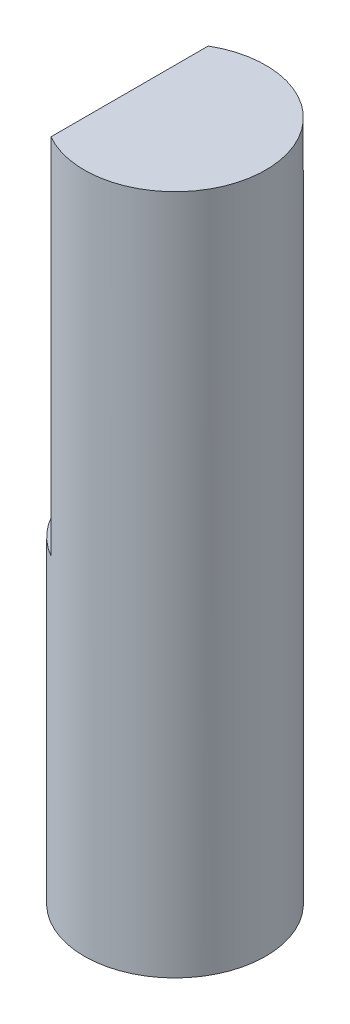
ISO-10303-21;
HEADER;
FILE_DESCRIPTION(('STEP AP214'),'2;1');
FILE_NAME('part.step','',(''),(''),'','','');
FILE_SCHEMA(('AUTOMOTIVE_DESIGN { 1 0 10303 214 1 1 1 1 }'));
ENDSEC;
DATA;
#1=APPLICATION_CONTEXT('core data for automotive mechanical design processes');
#2=APPLICATION_PROTOCOL_DEFINITION('international standard','automotive_design',2000,#1);
#3=PRODUCT_CONTEXT('',#1,'mechanical');
#4=PRODUCT('Part','Part','',(#3));
#5=PRODUCT_RELATED_PRODUCT_CATEGORY('part','',(#4));
#6=PRODUCT_DEFINITION_FORMATION('','',#4);
#7=PRODUCT_DEFINITION_CONTEXT('part definition',#1,'design');
#8=PRODUCT_DEFINITION('design','',#6,#7);
#9=PRODUCT_DEFINITION_SHAPE('','',#8);
#10=(LENGTH_UNIT() NAMED_UNIT(*) SI_UNIT(.MILLI.,.METRE.));
#11=(NAMED_UNIT(*) PLANE_ANGLE_UNIT() SI_UNIT($,.RADIAN.));
#12=(NAMED_UNIT(*) SI_UNIT($,.STERADIAN.) SOLID_ANGLE_UNIT());
#13=UNCERTAINTY_MEASURE_WITH_UNIT(LENGTH_MEASURE(1.E-05),#10,'distance_accuracy_value','');
#14=(GEOMETRIC_REPRESENTATION_CONTEXT(3) GLOBAL_UNCERTAINTY_ASSIGNED_CONTEXT((#13)) GLOBAL_UNIT_ASSIGNED_CONTEXT((#10,
#11,#12)) REPRESENTATION_CONTEXT('',''));
#15=CARTESIAN_POINT('',(0.,0.,0.));
#16=DIRECTION('',(0.,0.,1.));
#17=DIRECTION('',(1.,0.,0.));
#18=AXIS2_PLACEMENT_3D('',#15,#16,#17);
#19=CARTESIAN_POINT('',(0.,15.,0.));
#20=DIRECTION('',(0.,-1.,0.));
#21=DIRECTION('',(0.,0.,-1.));
#22=AXIS2_PLACEMENT_3D('',#19,#20,#21);
#23=CYLINDRICAL_SURFACE('',#22,2.);
#24=CARTESIAN_POINT('',(0.,15.,0.));
#25=DIRECTION('',(0.,1.,0.));
#26=DIRECTION('',(0.,0.,1.));
#27=AXIS2_PLACEMENT_3D('',#24,#25,#26);
#28=CIRCLE('',#27,2.);
#29=CARTESIAN_POINT('',(-1.,15.,1.73205080756888));
#30=VERTEX_POINT('',#29);
#31=CARTESIAN_POINT('',(-1.,15.,-1.73205080756888));
#32=VERTEX_POINT('',#31);
#33=EDGE_CURVE('E11',#30,#32,#28,.T.);
#34=ORIENTED_EDGE('',*,*,#33,.F.);
#35=DIRECTION('',(0.,1.,0.));
#36=VECTOR('',#35,1.);
#37=CARTESIAN_POINT('',(-1.,7.,1.73205080756888));
#38=LINE('',#37,#36);
#39=CARTESIAN_POINT('',(-1.,7.,1.73205080756888));
#40=VERTEX_POINT('',#39);
#41=EDGE_CURVE('E51',#40,#30,#38,.T.);
#42=ORIENTED_EDGE('',*,*,#41,.F.);
#43=CARTESIAN_POINT('',(0.,7.,0.));
#44=DIRECTION('',(0.,1.,0.));
#45=DIRECTION('',(0.,0.,1.));
#46=AXIS2_PLACEMENT_3D('',#43,#44,#45);
#47=CIRCLE('',#46,2.);
#48=CARTESIAN_POINT('',(-1.,7.,-1.73205080756888));
#49=VERTEX_POINT('',#48);
#50=EDGE_CURVE('E66',#49,#40,#47,.T.);
#51=ORIENTED_EDGE('',*,*,#50,.F.);
#52=DIRECTION('',(0.,1.,0.));
#53=VECTOR('',#52,1.);
#54=CARTESIAN_POINT('',(-1.,7.,-1.73205080756888));
#55=LINE('',#54,#53);
#56=EDGE_CURVE('E57',#49,#32,#55,.T.);
#57=ORIENTED_EDGE('',*,*,#56,.T.);
#58=EDGE_LOOP('',(#34,#42,#51,#57));
#59=FACE_BOUND('',#58,.T.);
#60=CARTESIAN_POINT('',(0.,0.,0.));
#61=DIRECTION('',(0.,1.,0.));
#62=DIRECTION('',(0.,0.,1.));
#63=AXIS2_PLACEMENT_3D('',#60,#61,#62);
#64=CIRCLE('',#63,2.);
#65=CARTESIAN_POINT('',(0.,0.,2.));
#66=VERTEX_POINT('',#65);
#67=EDGE_CURVE('E40',#66,#66,#64,.T.);
#68=ORIENTED_EDGE('',*,*,#67,.T.);
#69=EDGE_LOOP('',(#68));
#70=FACE_BOUND('',#69,.T.);
#71=ADVANCED_FACE('F37',(#59,#70),#23,.T.);
#72=CARTESIAN_POINT('',(0.,15.,0.));
#73=DIRECTION('',(0.,1.,0.));
#74=DIRECTION('',(0.,0.,1.));
#75=AXIS2_PLACEMENT_3D('',#72,#73,#74);
#76=PLANE('',#75);
#77=DIRECTION('',(0.,0.,-1.));
#78=VECTOR('',#77,1.);
#79=CARTESIAN_POINT('',(-1.,15.,-1.73205080756888));
#80=LINE('',#79,#78);
#81=EDGE_CURVE('E62',#30,#32,#80,.T.);
#82=ORIENTED_EDGE('',*,*,#81,.F.);
#83=ORIENTED_EDGE('',*,*,#33,.T.);
#84=EDGE_LOOP('',(#82,#83));
#85=FACE_BOUND('',#84,.T.);
#86=ADVANCED_FACE('F72',(#85),#76,.T.);
#87=CARTESIAN_POINT('',(0.,0.,0.));
#88=DIRECTION('',(0.,1.,0.));
#89=DIRECTION('',(0.,0.,1.));
#90=AXIS2_PLACEMENT_3D('',#87,#88,#89);
#91=PLANE('',#90);
#92=ORIENTED_EDGE('',*,*,#67,.F.);
#93=EDGE_LOOP('',(#92));
#94=FACE_BOUND('',#93,.T.);
#95=ADVANCED_FACE('F74',(#94),#91,.F.);
#96=CARTESIAN_POINT('',(-1.,7.,-1.73205080756888));
#97=DIRECTION('',(1.,0.,0.));
#98=DIRECTION('',(0.,0.,-1.));
#99=AXIS2_PLACEMENT_3D('',#96,#97,#98);
#100=PLANE('',#99);
#101=ORIENTED_EDGE('',*,*,#81,.T.);
#102=ORIENTED_EDGE('',*,*,#56,.F.);
#103=DIRECTION('',(0.,0.,-1.));
#104=VECTOR('',#103,1.);
#105=CARTESIAN_POINT('',(-1.,7.,-1.73205080756888));
#106=LINE('',#105,#104);
#107=EDGE_CURVE('E89',#40,#49,#106,.T.);
#108=ORIENTED_EDGE('',*,*,#107,.F.);
#109=ORIENTED_EDGE('',*,*,#41,.T.);
#110=EDGE_LOOP('',(#101,#102,#108,#109));
#111=FACE_BOUND('',#110,.T.);
#112=ADVANCED_FACE('F63',(#111),#100,.F.);
#113=CARTESIAN_POINT('',(0.,7.,0.));
#114=DIRECTION('',(0.,1.,0.));
#115=DIRECTION('',(0.,0.,1.));
#116=AXIS2_PLACEMENT_3D('',#113,#114,#115);
#117=PLANE('',#116);
#118=ORIENTED_EDGE('',*,*,#50,.T.);
#119=ORIENTED_EDGE('',*,*,#107,.T.);
#120=EDGE_LOOP('',(#118,#119));
#121=FACE_BOUND('',#120,.T.);
#122=ADVANCED_FACE('F84',(#121),#117,.T.);
#123=CLOSED_SHELL('',(#71,#86,#95,#112,#122));
#124=MANIFOLD_SOLID_BREP('B2',#123);
#125=ADVANCED_BREP_SHAPE_REPRESENTATION('',(#18,#124),#14);
#126=SHAPE_DEFINITION_REPRESENTATION(#9,#125);
ENDSEC;
END-ISO-10303-21;
